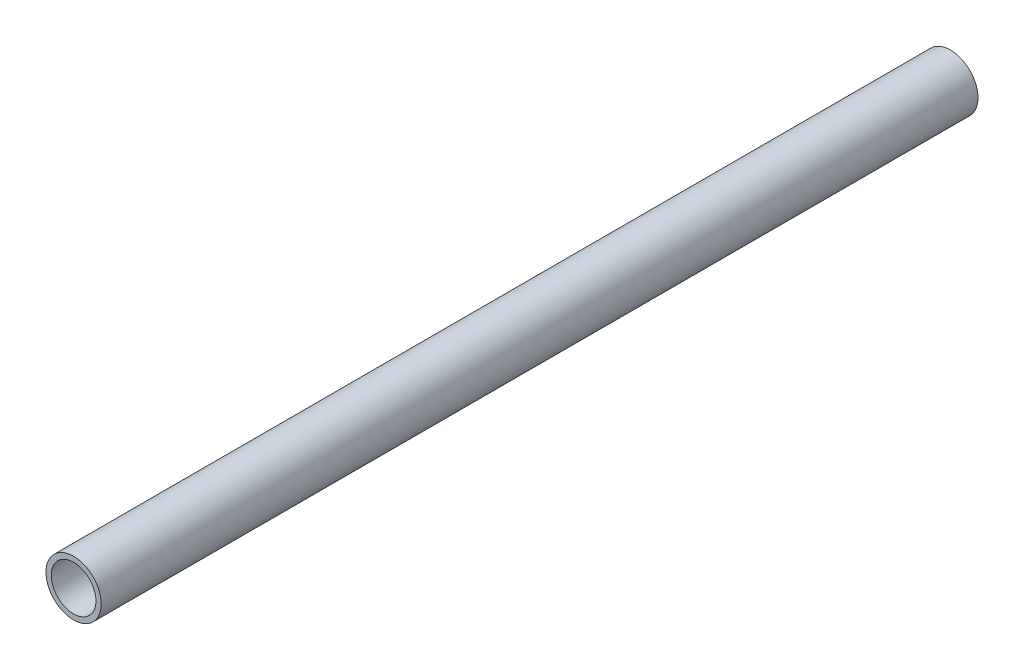
ISO-10303-21;
HEADER;
FILE_DESCRIPTION(('STEP AP214'),'2;1');
FILE_NAME('part.step','',(''),(''),'','','');
FILE_SCHEMA(('AUTOMOTIVE_DESIGN { 1 0 10303 214 1 1 1 1 }'));
ENDSEC;
DATA;
#1=APPLICATION_CONTEXT('core data for automotive mechanical design processes');
#2=APPLICATION_PROTOCOL_DEFINITION('international standard','automotive_design',2000,#1);
#3=PRODUCT_CONTEXT('',#1,'mechanical');
#4=PRODUCT('Part','Part','',(#3));
#5=PRODUCT_RELATED_PRODUCT_CATEGORY('part','',(#4));
#6=PRODUCT_DEFINITION_FORMATION('','',#4);
#7=PRODUCT_DEFINITION_CONTEXT('part definition',#1,'design');
#8=PRODUCT_DEFINITION('design','',#6,#7);
#9=PRODUCT_DEFINITION_SHAPE('','',#8);
#10=(LENGTH_UNIT() NAMED_UNIT(*) SI_UNIT(.MILLI.,.METRE.));
#11=(NAMED_UNIT(*) PLANE_ANGLE_UNIT() SI_UNIT($,.RADIAN.));
#12=(NAMED_UNIT(*) SI_UNIT($,.STERADIAN.) SOLID_ANGLE_UNIT());
#13=UNCERTAINTY_MEASURE_WITH_UNIT(LENGTH_MEASURE(1.E-05),#10,'distance_accuracy_value','');
#14=(GEOMETRIC_REPRESENTATION_CONTEXT(3) GLOBAL_UNCERTAINTY_ASSIGNED_CONTEXT((#13)) GLOBAL_UNIT_ASSIGNED_CONTEXT((#10,
#11,#12)) REPRESENTATION_CONTEXT('',''));
#15=CARTESIAN_POINT('',(0.,0.,0.));
#16=DIRECTION('',(0.,0.,1.));
#17=DIRECTION('',(1.,0.,0.));
#18=AXIS2_PLACEMENT_3D('',#15,#16,#17);
#19=CARTESIAN_POINT('',(0.,0.,-254.));
#20=DIRECTION('',(0.,0.,1.));
#21=DIRECTION('',(1.,0.,0.));
#22=AXIS2_PLACEMENT_3D('',#19,#20,#21);
#23=CYLINDRICAL_SURFACE('',#22,8.001);
#24=CARTESIAN_POINT('',(0.,0.,-254.));
#25=DIRECTION('',(0.,0.,1.));
#26=DIRECTION('',(1.,0.,0.));
#27=AXIS2_PLACEMENT_3D('',#24,#25,#26);
#28=CIRCLE('',#27,8.001);
#29=CARTESIAN_POINT('',(8.001,0.,-254.));
#30=VERTEX_POINT('',#29);
#31=EDGE_CURVE('E10',#30,#30,#28,.T.);
#32=ORIENTED_EDGE('',*,*,#31,.T.);
#33=EDGE_LOOP('',(#32));
#34=FACE_BOUND('',#33,.T.);
#35=CARTESIAN_POINT('',(0.,0.,0.));
#36=DIRECTION('',(0.,0.,1.));
#37=DIRECTION('',(1.,0.,0.));
#38=AXIS2_PLACEMENT_3D('',#35,#36,#37);
#39=CIRCLE('',#38,8.001);
#40=CARTESIAN_POINT('',(8.001,0.,0.));
#41=VERTEX_POINT('',#40);
#42=EDGE_CURVE('E46',#41,#41,#39,.T.);
#43=ORIENTED_EDGE('',*,*,#42,.F.);
#44=EDGE_LOOP('',(#43));
#45=FACE_BOUND('',#44,.T.);
#46=ADVANCED_FACE('F43',(#34,#45),#23,.T.);
#47=CARTESIAN_POINT('',(0.,0.,-254.));
#48=DIRECTION('',(0.,0.,1.));
#49=DIRECTION('',(1.,0.,0.));
#50=AXIS2_PLACEMENT_3D('',#47,#48,#49);
#51=PLANE('',#50);
#52=CARTESIAN_POINT('',(0.,0.,-254.));
#53=DIRECTION('',(0.,0.,1.));
#54=DIRECTION('',(1.,0.,0.));
#55=AXIS2_PLACEMENT_3D('',#52,#53,#54);
#56=CIRCLE('',#55,6.477);
#57=CARTESIAN_POINT('',(6.477,0.,-254.));
#58=VERTEX_POINT('',#57);
#59=EDGE_CURVE('E55',#58,#58,#56,.T.);
#60=ORIENTED_EDGE('',*,*,#59,.T.);
#61=EDGE_LOOP('',(#60));
#62=FACE_BOUND('',#61,.T.);
#63=ORIENTED_EDGE('',*,*,#31,.F.);
#64=EDGE_LOOP('',(#63));
#65=FACE_BOUND('',#64,.T.);
#66=ADVANCED_FACE('F65',(#62,#65),#51,.F.);
#67=CARTESIAN_POINT('',(0.,0.,0.));
#68=DIRECTION('',(0.,0.,1.));
#69=DIRECTION('',(1.,0.,0.));
#70=AXIS2_PLACEMENT_3D('',#67,#68,#69);
#71=PLANE('',#70);
#72=CARTESIAN_POINT('',(0.,0.,0.));
#73=DIRECTION('',(0.,0.,1.));
#74=DIRECTION('',(1.,0.,0.));
#75=AXIS2_PLACEMENT_3D('',#72,#73,#74);
#76=CIRCLE('',#75,6.477);
#77=CARTESIAN_POINT('',(6.477,0.,0.));
#78=VERTEX_POINT('',#77);
#79=EDGE_CURVE('E57',#78,#78,#76,.T.);
#80=ORIENTED_EDGE('',*,*,#79,.F.);
#81=EDGE_LOOP('',(#80));
#82=FACE_BOUND('',#81,.T.);
#83=ORIENTED_EDGE('',*,*,#42,.T.);
#84=EDGE_LOOP('',(#83));
#85=FACE_BOUND('',#84,.T.);
#86=ADVANCED_FACE('F71',(#82,#85),#71,.T.);
#87=CARTESIAN_POINT('',(0.,0.,-254.));
#88=DIRECTION('',(0.,0.,1.));
#89=DIRECTION('',(1.,0.,0.));
#90=AXIS2_PLACEMENT_3D('',#87,#88,#89);
#91=CYLINDRICAL_SURFACE('',#90,6.477);
#92=ORIENTED_EDGE('',*,*,#59,.F.);
#93=EDGE_LOOP('',(#92));
#94=FACE_BOUND('',#93,.T.);
#95=ORIENTED_EDGE('',*,*,#79,.T.);
#96=EDGE_LOOP('',(#95));
#97=FACE_BOUND('',#96,.T.);
#98=ADVANCED_FACE('F68',(#94,#97),#91,.F.);
#99=CLOSED_SHELL('',(#46,#66,#86,#98));
#100=MANIFOLD_SOLID_BREP('B2',#99);
#101=ADVANCED_BREP_SHAPE_REPRESENTATION('',(#18,#100),#14);
#102=SHAPE_DEFINITION_REPRESENTATION(#9,#101);
ENDSEC;
END-ISO-10303-21;
